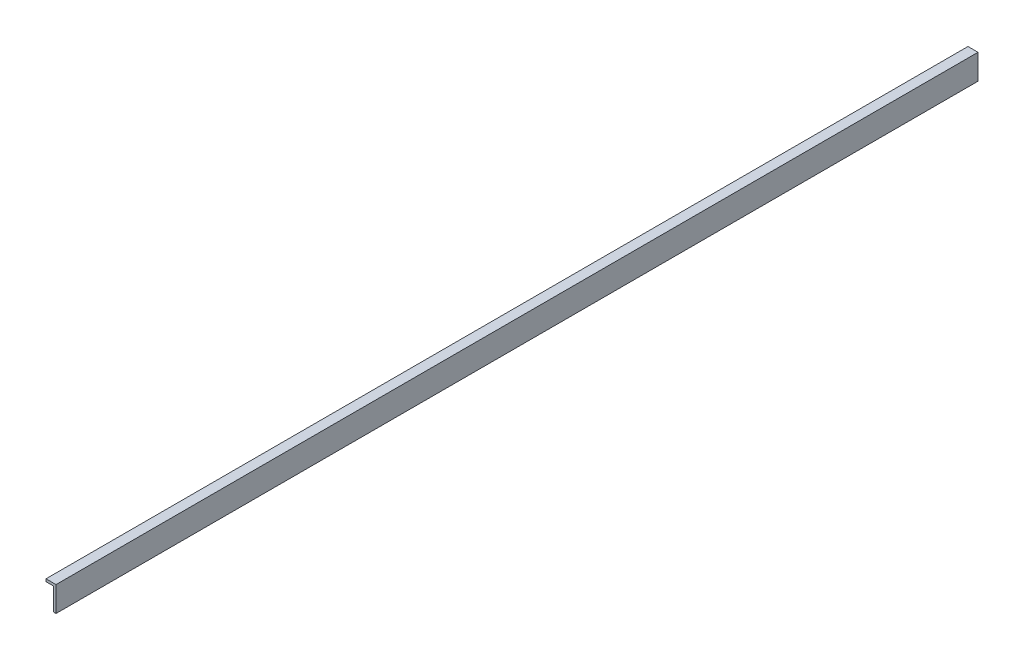
ISO-10303-21;
HEADER;
FILE_DESCRIPTION(('STEP AP214'),'2;1');
FILE_NAME('part.step','',(''),(''),'','','');
FILE_SCHEMA(('AUTOMOTIVE_DESIGN { 1 0 10303 214 1 1 1 1 }'));
ENDSEC;
DATA;
#1=APPLICATION_CONTEXT('core data for automotive mechanical design processes');
#2=APPLICATION_PROTOCOL_DEFINITION('international standard','automotive_design',2000,#1);
#3=PRODUCT_CONTEXT('',#1,'mechanical');
#4=PRODUCT('Part','Part','',(#3));
#5=PRODUCT_RELATED_PRODUCT_CATEGORY('part','',(#4));
#6=PRODUCT_DEFINITION_FORMATION('','',#4);
#7=PRODUCT_DEFINITION_CONTEXT('part definition',#1,'design');
#8=PRODUCT_DEFINITION('design','',#6,#7);
#9=PRODUCT_DEFINITION_SHAPE('','',#8);
#10=(LENGTH_UNIT() NAMED_UNIT(*) SI_UNIT(.MILLI.,.METRE.));
#11=(NAMED_UNIT(*) PLANE_ANGLE_UNIT() SI_UNIT($,.RADIAN.));
#12=(NAMED_UNIT(*) SI_UNIT($,.STERADIAN.) SOLID_ANGLE_UNIT());
#13=UNCERTAINTY_MEASURE_WITH_UNIT(LENGTH_MEASURE(1.E-05),#10,'distance_accuracy_value','');
#14=(GEOMETRIC_REPRESENTATION_CONTEXT(3) GLOBAL_UNCERTAINTY_ASSIGNED_CONTEXT((#13)) GLOBAL_UNIT_ASSIGNED_CONTEXT((#10,
#11,#12)) REPRESENTATION_CONTEXT('',''));
#15=CARTESIAN_POINT('',(0.,0.,0.));
#16=DIRECTION('',(0.,0.,1.));
#17=DIRECTION('',(1.,0.,0.));
#18=AXIS2_PLACEMENT_3D('',#15,#16,#17);
#19=CARTESIAN_POINT('',(353.5,422.5,-755.5));
#20=DIRECTION('',(-1.,0.,0.));
#21=DIRECTION('',(0.,0.,1.));
#22=AXIS2_PLACEMENT_3D('',#19,#20,#21);
#23=PLANE('',#22);
#24=DIRECTION('',(0.,-1.,0.));
#25=VECTOR('',#24,1.);
#26=CARTESIAN_POINT('',(353.5,422.5,-20.));
#27=LINE('',#26,#25);
#28=CARTESIAN_POINT('',(353.5,422.5,-20.));
#29=VERTEX_POINT('',#28);
#30=CARTESIAN_POINT('',(353.5,404.5,-20.));
#31=VERTEX_POINT('',#30);
#32=EDGE_CURVE('E124',#29,#31,#27,.T.);
#33=ORIENTED_EDGE('',*,*,#32,.F.);
#34=DIRECTION('',(0.,0.,1.));
#35=VECTOR('',#34,1.);
#36=CARTESIAN_POINT('',(353.5,422.5,-755.5));
#37=LINE('',#36,#35);
#38=CARTESIAN_POINT('',(353.5,422.5,-755.5));
#39=VERTEX_POINT('',#38);
#40=EDGE_CURVE('E11',#39,#29,#37,.T.);
#41=ORIENTED_EDGE('',*,*,#40,.F.);
#42=DIRECTION('',(0.,-1.,0.));
#43=VECTOR('',#42,1.);
#44=CARTESIAN_POINT('',(353.5,422.5,-755.5));
#45=LINE('',#44,#43);
#46=CARTESIAN_POINT('',(353.5,404.5,-755.5));
#47=VERTEX_POINT('',#46);
#48=EDGE_CURVE('E138',#39,#47,#45,.T.);
#49=ORIENTED_EDGE('',*,*,#48,.T.);
#50=DIRECTION('',(0.,0.,1.));
#51=VECTOR('',#50,1.);
#52=CARTESIAN_POINT('',(353.5,404.5,-755.5));
#53=LINE('',#52,#51);
#54=EDGE_CURVE('E42',#47,#31,#53,.T.);
#55=ORIENTED_EDGE('',*,*,#54,.T.);
#56=EDGE_LOOP('',(#33,#41,#49,#55));
#57=FACE_BOUND('',#56,.T.);
#58=ADVANCED_FACE('F39',(#57),#23,.T.);
#59=CARTESIAN_POINT('',(347.5,422.5,-755.5));
#60=DIRECTION('',(0.,-1.,0.));
#61=DIRECTION('',(0.,0.,-1.));
#62=AXIS2_PLACEMENT_3D('',#59,#60,#61);
#63=PLANE('',#62);
#64=DIRECTION('',(1.,0.,0.));
#65=VECTOR('',#64,1.);
#66=CARTESIAN_POINT('',(347.5,422.5,-20.));
#67=LINE('',#66,#65);
#68=CARTESIAN_POINT('',(347.5,422.5,-20.));
#69=VERTEX_POINT('',#68);
#70=EDGE_CURVE('E136',#69,#29,#67,.T.);
#71=ORIENTED_EDGE('',*,*,#70,.F.);
#72=DIRECTION('',(0.,0.,1.));
#73=VECTOR('',#72,1.);
#74=CARTESIAN_POINT('',(347.5,422.5,-755.5));
#75=LINE('',#74,#73);
#76=CARTESIAN_POINT('',(347.5,422.5,-755.5));
#77=VERTEX_POINT('',#76);
#78=EDGE_CURVE('E48',#77,#69,#75,.T.);
#79=ORIENTED_EDGE('',*,*,#78,.F.);
#80=DIRECTION('',(1.,0.,0.));
#81=VECTOR('',#80,1.);
#82=CARTESIAN_POINT('',(347.5,422.5,-755.5));
#83=LINE('',#82,#81);
#84=EDGE_CURVE('E114',#77,#39,#83,.T.);
#85=ORIENTED_EDGE('',*,*,#84,.T.);
#86=ORIENTED_EDGE('',*,*,#40,.T.);
#87=EDGE_LOOP('',(#71,#79,#85,#86));
#88=FACE_BOUND('',#87,.T.);
#89=ADVANCED_FACE('F146',(#88),#63,.T.);
#90=CARTESIAN_POINT('',(347.5,424.5,-755.5));
#91=DIRECTION('',(-1.,0.,0.));
#92=DIRECTION('',(0.,0.,1.));
#93=AXIS2_PLACEMENT_3D('',#90,#91,#92);
#94=PLANE('',#93);
#95=DIRECTION('',(0.,-1.,0.));
#96=VECTOR('',#95,1.);
#97=CARTESIAN_POINT('',(347.5,424.5,-20.));
#98=LINE('',#97,#96);
#99=CARTESIAN_POINT('',(347.5,424.5,-20.));
#100=VERTEX_POINT('',#99);
#101=EDGE_CURVE('E101',#100,#69,#98,.T.);
#102=ORIENTED_EDGE('',*,*,#101,.F.);
#103=DIRECTION('',(0.,0.,1.));
#104=VECTOR('',#103,1.);
#105=CARTESIAN_POINT('',(347.5,424.5,-755.5));
#106=LINE('',#105,#104);
#107=CARTESIAN_POINT('',(347.5,424.5,-755.5));
#108=VERTEX_POINT('',#107);
#109=EDGE_CURVE('E96',#108,#100,#106,.T.);
#110=ORIENTED_EDGE('',*,*,#109,.F.);
#111=DIRECTION('',(0.,-1.,0.));
#112=VECTOR('',#111,1.);
#113=CARTESIAN_POINT('',(347.5,424.5,-755.5));
#114=LINE('',#113,#112);
#115=EDGE_CURVE('E99',#108,#77,#114,.T.);
#116=ORIENTED_EDGE('',*,*,#115,.T.);
#117=ORIENTED_EDGE('',*,*,#78,.T.);
#118=EDGE_LOOP('',(#102,#110,#116,#117));
#119=FACE_BOUND('',#118,.T.);
#120=ADVANCED_FACE('F98',(#119),#94,.T.);
#121=CARTESIAN_POINT('',(355.5,424.5,-755.5));
#122=DIRECTION('',(0.,1.,0.));
#123=DIRECTION('',(0.,0.,1.));
#124=AXIS2_PLACEMENT_3D('',#121,#122,#123);
#125=PLANE('',#124);
#126=DIRECTION('',(-1.,0.,0.));
#127=VECTOR('',#126,1.);
#128=CARTESIAN_POINT('',(355.5,424.5,-20.));
#129=LINE('',#128,#127);
#130=CARTESIAN_POINT('',(355.5,424.5,-20.));
#131=VERTEX_POINT('',#130);
#132=EDGE_CURVE('E133',#131,#100,#129,.T.);
#133=ORIENTED_EDGE('',*,*,#132,.F.);
#134=DIRECTION('',(0.,0.,1.));
#135=VECTOR('',#134,1.);
#136=CARTESIAN_POINT('',(355.5,424.5,-755.5));
#137=LINE('',#136,#135);
#138=CARTESIAN_POINT('',(355.5,424.5,-755.5));
#139=VERTEX_POINT('',#138);
#140=EDGE_CURVE('E106',#139,#131,#137,.T.);
#141=ORIENTED_EDGE('',*,*,#140,.F.);
#142=DIRECTION('',(-1.,0.,0.));
#143=VECTOR('',#142,1.);
#144=CARTESIAN_POINT('',(355.5,424.5,-755.5));
#145=LINE('',#144,#143);
#146=EDGE_CURVE('E112',#139,#108,#145,.T.);
#147=ORIENTED_EDGE('',*,*,#146,.T.);
#148=ORIENTED_EDGE('',*,*,#109,.T.);
#149=EDGE_LOOP('',(#133,#141,#147,#148));
#150=FACE_BOUND('',#149,.T.);
#151=ADVANCED_FACE('F116',(#150),#125,.T.);
#152=CARTESIAN_POINT('',(355.5,404.5,-755.5));
#153=DIRECTION('',(1.,0.,0.));
#154=DIRECTION('',(0.,0.,-1.));
#155=AXIS2_PLACEMENT_3D('',#152,#153,#154);
#156=PLANE('',#155);
#157=DIRECTION('',(0.,1.,0.));
#158=VECTOR('',#157,1.);
#159=CARTESIAN_POINT('',(355.5,404.5,-20.));
#160=LINE('',#159,#158);
#161=CARTESIAN_POINT('',(355.5,404.5,-20.));
#162=VERTEX_POINT('',#161);
#163=EDGE_CURVE('E130',#162,#131,#160,.T.);
#164=ORIENTED_EDGE('',*,*,#163,.F.);
#165=DIRECTION('',(0.,0.,1.));
#166=VECTOR('',#165,1.);
#167=CARTESIAN_POINT('',(355.5,404.5,-755.5));
#168=LINE('',#167,#166);
#169=CARTESIAN_POINT('',(355.5,404.5,-755.5));
#170=VERTEX_POINT('',#169);
#171=EDGE_CURVE('E141',#170,#162,#168,.T.);
#172=ORIENTED_EDGE('',*,*,#171,.F.);
#173=DIRECTION('',(0.,1.,0.));
#174=VECTOR('',#173,1.);
#175=CARTESIAN_POINT('',(355.5,404.5,-755.5));
#176=LINE('',#175,#174);
#177=EDGE_CURVE('E117',#170,#139,#176,.T.);
#178=ORIENTED_EDGE('',*,*,#177,.T.);
#179=ORIENTED_EDGE('',*,*,#140,.T.);
#180=EDGE_LOOP('',(#164,#172,#178,#179));
#181=FACE_BOUND('',#180,.T.);
#182=ADVANCED_FACE('F159',(#181),#156,.T.);
#183=CARTESIAN_POINT('',(353.5,404.5,-755.5));
#184=DIRECTION('',(0.,-1.,0.));
#185=DIRECTION('',(0.,0.,-1.));
#186=AXIS2_PLACEMENT_3D('',#183,#184,#185);
#187=PLANE('',#186);
#188=DIRECTION('',(1.,0.,0.));
#189=VECTOR('',#188,1.);
#190=CARTESIAN_POINT('',(353.5,404.5,-20.));
#191=LINE('',#190,#189);
#192=EDGE_CURVE('E127',#31,#162,#191,.T.);
#193=ORIENTED_EDGE('',*,*,#192,.F.);
#194=ORIENTED_EDGE('',*,*,#54,.F.);
#195=DIRECTION('',(1.,0.,0.));
#196=VECTOR('',#195,1.);
#197=CARTESIAN_POINT('',(353.5,404.5,-755.5));
#198=LINE('',#197,#196);
#199=EDGE_CURVE('E119',#47,#170,#198,.T.);
#200=ORIENTED_EDGE('',*,*,#199,.T.);
#201=ORIENTED_EDGE('',*,*,#171,.T.);
#202=EDGE_LOOP('',(#193,#194,#200,#201));
#203=FACE_BOUND('',#202,.T.);
#204=ADVANCED_FACE('F143',(#203),#187,.T.);
#205=CARTESIAN_POINT('',(0.,0.,-755.5));
#206=DIRECTION('',(0.,0.,1.));
#207=DIRECTION('',(1.,0.,0.));
#208=AXIS2_PLACEMENT_3D('',#205,#206,#207);
#209=PLANE('',#208);
#210=ORIENTED_EDGE('',*,*,#48,.F.);
#211=ORIENTED_EDGE('',*,*,#84,.F.);
#212=ORIENTED_EDGE('',*,*,#115,.F.);
#213=ORIENTED_EDGE('',*,*,#146,.F.);
#214=ORIENTED_EDGE('',*,*,#177,.F.);
#215=ORIENTED_EDGE('',*,*,#199,.F.);
#216=EDGE_LOOP('',(#210,#211,#212,#213,#214,#215));
#217=FACE_BOUND('',#216,.T.);
#218=ADVANCED_FACE('F110',(#217),#209,.F.);
#219=CARTESIAN_POINT('',(0.,0.,-20.));
#220=DIRECTION('',(0.,0.,1.));
#221=DIRECTION('',(1.,0.,0.));
#222=AXIS2_PLACEMENT_3D('',#219,#220,#221);
#223=PLANE('',#222);
#224=ORIENTED_EDGE('',*,*,#32,.T.);
#225=ORIENTED_EDGE('',*,*,#192,.T.);
#226=ORIENTED_EDGE('',*,*,#163,.T.);
#227=ORIENTED_EDGE('',*,*,#132,.T.);
#228=ORIENTED_EDGE('',*,*,#101,.T.);
#229=ORIENTED_EDGE('',*,*,#70,.T.);
#230=EDGE_LOOP('',(#224,#225,#226,#227,#228,#229));
#231=FACE_BOUND('',#230,.T.);
#232=ADVANCED_FACE('F145',(#231),#223,.T.);
#233=CLOSED_SHELL('',(#58,#89,#120,#151,#182,#204,#218,#232));
#234=MANIFOLD_SOLID_BREP('B2',#233);
#235=ADVANCED_BREP_SHAPE_REPRESENTATION('',(#18,#234),#14);
#236=SHAPE_DEFINITION_REPRESENTATION(#9,#235);
ENDSEC;
END-ISO-10303-21;
